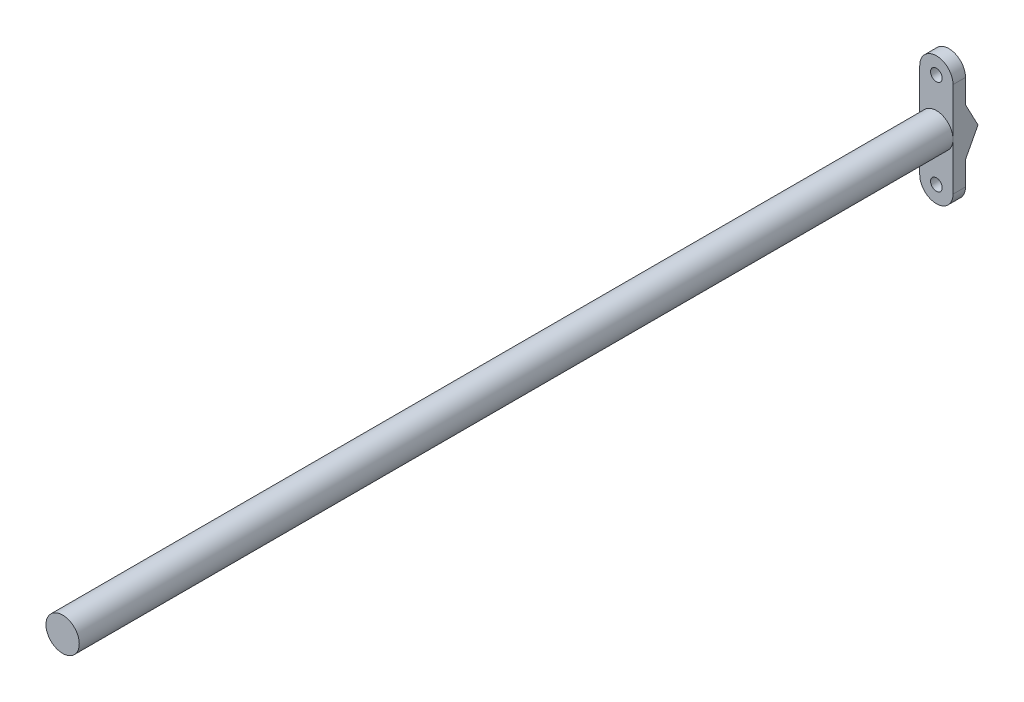
ISO-10303-21;
HEADER;
FILE_DESCRIPTION(('STEP AP214'),'2;1');
FILE_NAME('part.step','',(''),(''),'','','');
FILE_SCHEMA(('AUTOMOTIVE_DESIGN { 1 0 10303 214 1 1 1 1 }'));
ENDSEC;
DATA;
#1=APPLICATION_CONTEXT('core data for automotive mechanical design processes');
#2=APPLICATION_PROTOCOL_DEFINITION('international standard','automotive_design',2000,#1);
#3=PRODUCT_CONTEXT('',#1,'mechanical');
#4=PRODUCT('Part','Part','',(#3));
#5=PRODUCT_RELATED_PRODUCT_CATEGORY('part','',(#4));
#6=PRODUCT_DEFINITION_FORMATION('','',#4);
#7=PRODUCT_DEFINITION_CONTEXT('part definition',#1,'design');
#8=PRODUCT_DEFINITION('design','',#6,#7);
#9=PRODUCT_DEFINITION_SHAPE('','',#8);
#10=(LENGTH_UNIT() NAMED_UNIT(*) SI_UNIT(.MILLI.,.METRE.));
#11=(NAMED_UNIT(*) PLANE_ANGLE_UNIT() SI_UNIT($,.RADIAN.));
#12=(NAMED_UNIT(*) SI_UNIT($,.STERADIAN.) SOLID_ANGLE_UNIT());
#13=UNCERTAINTY_MEASURE_WITH_UNIT(LENGTH_MEASURE(1.E-05),#10,'distance_accuracy_value','');
#14=(GEOMETRIC_REPRESENTATION_CONTEXT(3) GLOBAL_UNCERTAINTY_ASSIGNED_CONTEXT((#13)) GLOBAL_UNIT_ASSIGNED_CONTEXT((#10,
#11,#12)) REPRESENTATION_CONTEXT('',''));
#15=CARTESIAN_POINT('',(0.,0.,0.));
#16=DIRECTION('',(0.,0.,1.));
#17=DIRECTION('',(1.,0.,0.));
#18=AXIS2_PLACEMENT_3D('',#15,#16,#17);
#19=CARTESIAN_POINT('',(4.,-11.4,3.));
#20=DIRECTION('',(-1.,0.,0.));
#21=DIRECTION('',(0.,0.,1.));
#22=AXIS2_PLACEMENT_3D('',#19,#20,#21);
#23=PLANE('',#22);
#24=DIRECTION('',(0.,1.,0.));
#25=VECTOR('',#24,1.);
#26=CARTESIAN_POINT('',(4.,-11.4,0.));
#27=LINE('',#26,#25);
#28=CARTESIAN_POINT('',(4.,-11.4,0.));
#29=VERTEX_POINT('',#28);
#30=CARTESIAN_POINT('',(4.,-5.7,0.));
#31=VERTEX_POINT('',#30);
#32=EDGE_CURVE('E154',#29,#31,#27,.T.);
#33=ORIENTED_EDGE('',*,*,#32,.T.);
#34=DIRECTION('',(0.,-0.884918222381982,0.465746432832622));
#35=VECTOR('',#34,1.);
#36=CARTESIAN_POINT('',(4.,-1.23644251626898,-2.34924078091106));
#37=LINE('',#36,#35);
#38=CARTESIAN_POINT('',(4.,0.,-3.));
#39=VERTEX_POINT('',#38);
#40=EDGE_CURVE('E135',#39,#31,#37,.T.);
#41=ORIENTED_EDGE('',*,*,#40,.F.);
#42=DIRECTION('',(0.,0.884918222381982,0.465746432832622));
#43=VECTOR('',#42,1.);
#44=CARTESIAN_POINT('',(4.,1.23644251626898,-2.34924078091106));
#45=LINE('',#44,#43);
#46=CARTESIAN_POINT('',(4.,5.7,0.));
#47=VERTEX_POINT('',#46);
#48=EDGE_CURVE('E144',#39,#47,#45,.T.);
#49=ORIENTED_EDGE('',*,*,#48,.T.);
#50=CARTESIAN_POINT('',(4.,11.4,0.));
#51=VERTEX_POINT('',#50);
#52=EDGE_CURVE('E172',#47,#51,#27,.T.);
#53=ORIENTED_EDGE('',*,*,#52,.T.);
#54=DIRECTION('',(0.,0.,-1.));
#55=VECTOR('',#54,1.);
#56=CARTESIAN_POINT('',(4.,11.4,3.));
#57=LINE('',#56,#55);
#58=CARTESIAN_POINT('',(4.,11.4,3.));
#59=VERTEX_POINT('',#58);
#60=EDGE_CURVE('E163',#59,#51,#57,.T.);
#61=ORIENTED_EDGE('',*,*,#60,.F.);
#62=DIRECTION('',(0.,1.,0.));
#63=VECTOR('',#62,1.);
#64=CARTESIAN_POINT('',(4.,-11.4,3.));
#65=LINE('',#64,#63);
#66=CARTESIAN_POINT('',(4.,0.,3.));
#67=VERTEX_POINT('',#66);
#68=EDGE_CURVE('E184',#67,#59,#65,.T.);
#69=ORIENTED_EDGE('',*,*,#68,.F.);
#70=CARTESIAN_POINT('',(4.,-11.4,3.));
#71=VERTEX_POINT('',#70);
#72=EDGE_CURVE('E107',#71,#67,#65,.T.);
#73=ORIENTED_EDGE('',*,*,#72,.F.);
#74=DIRECTION('',(0.,0.,-1.));
#75=VECTOR('',#74,1.);
#76=CARTESIAN_POINT('',(4.,-11.4,3.));
#77=LINE('',#76,#75);
#78=EDGE_CURVE('E62',#71,#29,#77,.T.);
#79=ORIENTED_EDGE('',*,*,#78,.T.);
#80=EDGE_LOOP('',(#33,#41,#49,#53,#61,#69,#73,#79));
#81=FACE_BOUND('',#80,.T.);
#82=ADVANCED_FACE('F58',(#81),#23,.F.);
#83=CARTESIAN_POINT('',(-4.,-11.4,3.));
#84=DIRECTION('',(1.,0.,0.));
#85=DIRECTION('',(0.,0.,-1.));
#86=AXIS2_PLACEMENT_3D('',#83,#84,#85);
#87=PLANE('',#86);
#88=DIRECTION('',(0.,0.884918222381982,0.465746432832622));
#89=VECTOR('',#88,1.);
#90=CARTESIAN_POINT('',(-4.,1.23644251626898,-2.34924078091106));
#91=LINE('',#90,#89);
#92=CARTESIAN_POINT('',(-4.,0.,-3.));
#93=VERTEX_POINT('',#92);
#94=CARTESIAN_POINT('',(-4.,5.7,0.));
#95=VERTEX_POINT('',#94);
#96=EDGE_CURVE('E143',#93,#95,#91,.T.);
#97=ORIENTED_EDGE('',*,*,#96,.F.);
#98=DIRECTION('',(0.,-0.884918222381982,0.465746432832622));
#99=VECTOR('',#98,1.);
#100=CARTESIAN_POINT('',(-4.,-1.23644251626898,-2.34924078091106));
#101=LINE('',#100,#99);
#102=CARTESIAN_POINT('',(-4.,-5.7,0.));
#103=VERTEX_POINT('',#102);
#104=EDGE_CURVE('E132',#93,#103,#101,.T.);
#105=ORIENTED_EDGE('',*,*,#104,.T.);
#106=DIRECTION('',(0.,-1.,0.));
#107=VECTOR('',#106,1.);
#108=CARTESIAN_POINT('',(-4.,-11.4,0.));
#109=LINE('',#108,#107);
#110=CARTESIAN_POINT('',(-4.,-11.4,0.));
#111=VERTEX_POINT('',#110);
#112=EDGE_CURVE('E100',#103,#111,#109,.T.);
#113=ORIENTED_EDGE('',*,*,#112,.T.);
#114=DIRECTION('',(0.,0.,-1.));
#115=VECTOR('',#114,1.);
#116=CARTESIAN_POINT('',(-4.,-11.4,3.));
#117=LINE('',#116,#115);
#118=CARTESIAN_POINT('',(-4.,-11.4,3.));
#119=VERTEX_POINT('',#118);
#120=EDGE_CURVE('E158',#119,#111,#117,.T.);
#121=ORIENTED_EDGE('',*,*,#120,.F.);
#122=DIRECTION('',(0.,-1.,0.));
#123=VECTOR('',#122,1.);
#124=CARTESIAN_POINT('',(-4.,-11.4,3.));
#125=LINE('',#124,#123);
#126=CARTESIAN_POINT('',(-4.,0.,3.));
#127=VERTEX_POINT('',#126);
#128=EDGE_CURVE('E78',#127,#119,#125,.T.);
#129=ORIENTED_EDGE('',*,*,#128,.F.);
#130=CARTESIAN_POINT('',(-4.,11.4,3.));
#131=VERTEX_POINT('',#130);
#132=EDGE_CURVE('E161',#131,#127,#125,.T.);
#133=ORIENTED_EDGE('',*,*,#132,.F.);
#134=DIRECTION('',(0.,0.,-1.));
#135=VECTOR('',#134,1.);
#136=CARTESIAN_POINT('',(-4.,11.4,3.));
#137=LINE('',#136,#135);
#138=CARTESIAN_POINT('',(-4.,11.4,0.));
#139=VERTEX_POINT('',#138);
#140=EDGE_CURVE('E160',#131,#139,#137,.T.);
#141=ORIENTED_EDGE('',*,*,#140,.T.);
#142=EDGE_CURVE('E150',#139,#95,#109,.T.);
#143=ORIENTED_EDGE('',*,*,#142,.T.);
#144=EDGE_LOOP('',(#97,#105,#113,#121,#129,#133,#141,#143));
#145=FACE_BOUND('',#144,.T.);
#146=ADVANCED_FACE('F141',(#145),#87,.F.);
#147=CARTESIAN_POINT('',(0.,-11.4,0.));
#148=DIRECTION('',(0.,0.,1.));
#149=DIRECTION('',(1.,0.,0.));
#150=AXIS2_PLACEMENT_3D('',#147,#148,#149);
#151=PLANE('',#150);
#152=CARTESIAN_POINT('',(0.,-11.4,0.));
#153=DIRECTION('',(0.,0.,1.));
#154=DIRECTION('',(-1.,0.,0.));
#155=AXIS2_PLACEMENT_3D('',#152,#153,#154);
#156=CIRCLE('',#155,1.4);
#157=CARTESIAN_POINT('',(-1.4,-11.4,0.));
#158=VERTEX_POINT('',#157);
#159=EDGE_CURVE('E189',#158,#158,#156,.T.);
#160=ORIENTED_EDGE('',*,*,#159,.T.);
#161=EDGE_LOOP('',(#160));
#162=FACE_BOUND('',#161,.T.);
#163=DIRECTION('',(-1.,0.,0.));
#164=VECTOR('',#163,1.);
#165=CARTESIAN_POINT('',(0.,-5.7,0.));
#166=LINE('',#165,#164);
#167=EDGE_CURVE('E130',#31,#103,#166,.T.);
#168=ORIENTED_EDGE('',*,*,#167,.F.);
#169=ORIENTED_EDGE('',*,*,#32,.F.);
#170=CARTESIAN_POINT('',(0.,-11.4,0.));
#171=DIRECTION('',(0.,0.,1.));
#172=DIRECTION('',(1.,0.,0.));
#173=AXIS2_PLACEMENT_3D('',#170,#171,#172);
#174=CIRCLE('',#173,4.);
#175=EDGE_CURVE('E149',#111,#29,#174,.T.);
#176=ORIENTED_EDGE('',*,*,#175,.F.);
#177=ORIENTED_EDGE('',*,*,#112,.F.);
#178=EDGE_LOOP('',(#168,#169,#176,#177));
#179=FACE_BOUND('',#178,.T.);
#180=ADVANCED_FACE('F147',(#162,#179),#151,.F.);
#181=CARTESIAN_POINT('',(0.,-11.4,3.));
#182=DIRECTION('',(0.,0.,1.));
#183=DIRECTION('',(1.,0.,0.));
#184=AXIS2_PLACEMENT_3D('',#181,#182,#183);
#185=PLANE('',#184);
#186=CARTESIAN_POINT('',(0.,0.,3.));
#187=DIRECTION('',(0.,0.,1.));
#188=DIRECTION('',(1.,0.,0.));
#189=AXIS2_PLACEMENT_3D('',#186,#187,#188);
#190=CIRCLE('',#189,4.);
#191=EDGE_CURVE('E68',#67,#127,#190,.T.);
#192=ORIENTED_EDGE('',*,*,#191,.F.);
#193=ORIENTED_EDGE('',*,*,#68,.T.);
#194=CARTESIAN_POINT('',(0.,11.4,3.));
#195=DIRECTION('',(0.,0.,1.));
#196=DIRECTION('',(1.,0.,0.));
#197=AXIS2_PLACEMENT_3D('',#194,#195,#196);
#198=CIRCLE('',#197,4.);
#199=EDGE_CURVE('E181',#59,#131,#198,.T.);
#200=ORIENTED_EDGE('',*,*,#199,.T.);
#201=ORIENTED_EDGE('',*,*,#132,.T.);
#202=EDGE_LOOP('',(#192,#193,#200,#201));
#203=FACE_BOUND('',#202,.T.);
#204=CARTESIAN_POINT('',(0.,11.4,3.));
#205=DIRECTION('',(0.,0.,1.));
#206=DIRECTION('',(1.,0.,0.));
#207=AXIS2_PLACEMENT_3D('',#204,#205,#206);
#208=CIRCLE('',#207,1.4);
#209=CARTESIAN_POINT('',(1.4,11.4,3.));
#210=VERTEX_POINT('',#209);
#211=EDGE_CURVE('E173',#210,#210,#208,.T.);
#212=ORIENTED_EDGE('',*,*,#211,.F.);
#213=EDGE_LOOP('',(#212));
#214=FACE_BOUND('',#213,.T.);
#215=ADVANCED_FACE('F218',(#203,#214),#185,.T.);
#216=EDGE_CURVE('E12',#127,#67,#190,.T.);
#217=ORIENTED_EDGE('',*,*,#216,.F.);
#218=ORIENTED_EDGE('',*,*,#128,.T.);
#219=CARTESIAN_POINT('',(0.,-11.4,3.));
#220=DIRECTION('',(0.,0.,1.));
#221=DIRECTION('',(1.,0.,0.));
#222=AXIS2_PLACEMENT_3D('',#219,#220,#221);
#223=CIRCLE('',#222,4.);
#224=EDGE_CURVE('E153',#119,#71,#223,.T.);
#225=ORIENTED_EDGE('',*,*,#224,.T.);
#226=ORIENTED_EDGE('',*,*,#72,.T.);
#227=EDGE_LOOP('',(#217,#218,#225,#226));
#228=FACE_BOUND('',#227,.T.);
#229=CARTESIAN_POINT('',(0.,-11.4,3.));
#230=DIRECTION('',(0.,0.,1.));
#231=DIRECTION('',(-1.,0.,0.));
#232=AXIS2_PLACEMENT_3D('',#229,#230,#231);
#233=CIRCLE('',#232,1.4);
#234=CARTESIAN_POINT('',(-1.4,-11.4,3.));
#235=VERTEX_POINT('',#234);
#236=EDGE_CURVE('E187',#235,#235,#233,.T.);
#237=ORIENTED_EDGE('',*,*,#236,.F.);
#238=EDGE_LOOP('',(#237));
#239=FACE_BOUND('',#238,.T.);
#240=ADVANCED_FACE('F247',(#228,#239),#185,.T.);
#241=ORIENTED_EDGE('',*,*,#52,.F.);
#242=DIRECTION('',(-1.,0.,0.));
#243=VECTOR('',#242,1.);
#244=CARTESIAN_POINT('',(0.,5.7,0.));
#245=LINE('',#244,#243);
#246=EDGE_CURVE('E138',#47,#95,#245,.T.);
#247=ORIENTED_EDGE('',*,*,#246,.T.);
#248=ORIENTED_EDGE('',*,*,#142,.F.);
#249=CARTESIAN_POINT('',(0.,11.4,0.));
#250=DIRECTION('',(0.,0.,1.));
#251=DIRECTION('',(1.,0.,0.));
#252=AXIS2_PLACEMENT_3D('',#249,#250,#251);
#253=CIRCLE('',#252,4.);
#254=EDGE_CURVE('E151',#51,#139,#253,.T.);
#255=ORIENTED_EDGE('',*,*,#254,.F.);
#256=EDGE_LOOP('',(#241,#247,#248,#255));
#257=FACE_BOUND('',#256,.T.);
#258=CARTESIAN_POINT('',(0.,11.4,0.));
#259=DIRECTION('',(0.,0.,1.));
#260=DIRECTION('',(1.,0.,0.));
#261=AXIS2_PLACEMENT_3D('',#258,#259,#260);
#262=CIRCLE('',#261,1.4);
#263=CARTESIAN_POINT('',(1.4,11.4,0.));
#264=VERTEX_POINT('',#263);
#265=EDGE_CURVE('E176',#264,#264,#262,.T.);
#266=ORIENTED_EDGE('',*,*,#265,.T.);
#267=EDGE_LOOP('',(#266));
#268=FACE_BOUND('',#267,.T.);
#269=ADVANCED_FACE('F211',(#257,#268),#151,.F.);
#270=CARTESIAN_POINT('',(0.,-11.4,3.));
#271=DIRECTION('',(0.,0.,-1.));
#272=DIRECTION('',(-1.,0.,0.));
#273=AXIS2_PLACEMENT_3D('',#270,#271,#272);
#274=CYLINDRICAL_SURFACE('',#273,4.);
#275=ORIENTED_EDGE('',*,*,#175,.T.);
#276=ORIENTED_EDGE('',*,*,#78,.F.);
#277=ORIENTED_EDGE('',*,*,#224,.F.);
#278=ORIENTED_EDGE('',*,*,#120,.T.);
#279=EDGE_LOOP('',(#275,#276,#277,#278));
#280=FACE_BOUND('',#279,.T.);
#281=ADVANCED_FACE('F60',(#280),#274,.T.);
#282=CARTESIAN_POINT('',(0.,11.4,3.));
#283=DIRECTION('',(0.,0.,-1.));
#284=DIRECTION('',(-1.,0.,0.));
#285=AXIS2_PLACEMENT_3D('',#282,#283,#284);
#286=CYLINDRICAL_SURFACE('',#285,4.);
#287=ORIENTED_EDGE('',*,*,#254,.T.);
#288=ORIENTED_EDGE('',*,*,#140,.F.);
#289=ORIENTED_EDGE('',*,*,#199,.F.);
#290=ORIENTED_EDGE('',*,*,#60,.T.);
#291=EDGE_LOOP('',(#287,#288,#289,#290));
#292=FACE_BOUND('',#291,.T.);
#293=ADVANCED_FACE('F215',(#292),#286,.T.);
#294=CARTESIAN_POINT('',(0.,11.4,3.));
#295=DIRECTION('',(0.,0.,-1.));
#296=DIRECTION('',(-1.,0.,0.));
#297=AXIS2_PLACEMENT_3D('',#294,#295,#296);
#298=CYLINDRICAL_SURFACE('',#297,1.4);
#299=ORIENTED_EDGE('',*,*,#211,.T.);
#300=EDGE_LOOP('',(#299));
#301=FACE_BOUND('',#300,.T.);
#302=ORIENTED_EDGE('',*,*,#265,.F.);
#303=EDGE_LOOP('',(#302));
#304=FACE_BOUND('',#303,.T.);
#305=ADVANCED_FACE('F233',(#301,#304),#298,.F.);
#306=CARTESIAN_POINT('',(0.,-11.4,3.));
#307=DIRECTION('',(0.,0.,-1.));
#308=DIRECTION('',(-1.,0.,0.));
#309=AXIS2_PLACEMENT_3D('',#306,#307,#308);
#310=CYLINDRICAL_SURFACE('',#309,1.4);
#311=ORIENTED_EDGE('',*,*,#236,.T.);
#312=EDGE_LOOP('',(#311));
#313=FACE_BOUND('',#312,.T.);
#314=ORIENTED_EDGE('',*,*,#159,.F.);
#315=EDGE_LOOP('',(#314));
#316=FACE_BOUND('',#315,.T.);
#317=ADVANCED_FACE('F224',(#313,#316),#310,.F.);
#318=CARTESIAN_POINT('',(0.,0.,213.));
#319=DIRECTION('',(0.,0.,-1.));
#320=DIRECTION('',(-1.,0.,0.));
#321=AXIS2_PLACEMENT_3D('',#318,#319,#320);
#322=CYLINDRICAL_SURFACE('',#321,4.);
#323=CARTESIAN_POINT('',(0.,0.,213.));
#324=DIRECTION('',(0.,0.,1.));
#325=DIRECTION('',(1.,0.,0.));
#326=AXIS2_PLACEMENT_3D('',#323,#324,#325);
#327=CIRCLE('',#326,4.);
#328=CARTESIAN_POINT('',(4.,0.,213.));
#329=VERTEX_POINT('',#328);
#330=EDGE_CURVE('E192',#329,#329,#327,.T.);
#331=ORIENTED_EDGE('',*,*,#330,.F.);
#332=EDGE_LOOP('',(#331));
#333=FACE_BOUND('',#332,.T.);
#334=ORIENTED_EDGE('',*,*,#191,.T.);
#335=ORIENTED_EDGE('',*,*,#216,.T.);
#336=EDGE_LOOP('',(#334,#335));
#337=FACE_BOUND('',#336,.T.);
#338=ADVANCED_FACE('F221',(#333,#337),#322,.T.);
#339=CARTESIAN_POINT('',(0.,0.,213.));
#340=DIRECTION('',(0.,0.,1.));
#341=DIRECTION('',(1.,0.,0.));
#342=AXIS2_PLACEMENT_3D('',#339,#340,#341);
#343=PLANE('',#342);
#344=ORIENTED_EDGE('',*,*,#330,.T.);
#345=EDGE_LOOP('',(#344));
#346=FACE_BOUND('',#345,.T.);
#347=ADVANCED_FACE('F223',(#346),#343,.T.);
#348=CARTESIAN_POINT('',(-4.,1.23644251626898,-2.34924078091106));
#349=DIRECTION('',(0.,0.465746432832622,-0.884918222381982));
#350=DIRECTION('',(0.,0.884918222381982,0.465746432832622));
#351=AXIS2_PLACEMENT_3D('',#348,#349,#350);
#352=PLANE('',#351);
#353=ORIENTED_EDGE('',*,*,#48,.F.);
#354=DIRECTION('',(1.,0.,0.));
#355=VECTOR('',#354,1.);
#356=CARTESIAN_POINT('',(-4.,0.,-3.));
#357=LINE('',#356,#355);
#358=EDGE_CURVE('E200',#93,#39,#357,.T.);
#359=ORIENTED_EDGE('',*,*,#358,.F.);
#360=ORIENTED_EDGE('',*,*,#96,.T.);
#361=ORIENTED_EDGE('',*,*,#246,.F.);
#362=EDGE_LOOP('',(#353,#359,#360,#361));
#363=FACE_BOUND('',#362,.T.);
#364=ADVANCED_FACE('F207',(#363),#352,.T.);
#365=CARTESIAN_POINT('',(-4.,-1.23644251626898,-2.34924078091106));
#366=DIRECTION('',(0.,0.465746432832622,0.884918222381982));
#367=DIRECTION('',(0.,-0.884918222381982,0.465746432832622));
#368=AXIS2_PLACEMENT_3D('',#365,#366,#367);
#369=PLANE('',#368);
#370=ORIENTED_EDGE('',*,*,#40,.T.);
#371=ORIENTED_EDGE('',*,*,#167,.T.);
#372=ORIENTED_EDGE('',*,*,#104,.F.);
#373=ORIENTED_EDGE('',*,*,#358,.T.);
#374=EDGE_LOOP('',(#370,#371,#372,#373));
#375=FACE_BOUND('',#374,.T.);
#376=ADVANCED_FACE('F131',(#375),#369,.F.);
#377=CLOSED_SHELL('',(#82,#146,#180,#215,#240,#269,#281,#293,#305,#317,#338,#347,#364,#376));
#378=MANIFOLD_SOLID_BREP('B2',#377);
#379=ADVANCED_BREP_SHAPE_REPRESENTATION('',(#18,#378),#14);
#380=SHAPE_DEFINITION_REPRESENTATION(#9,#379);
ENDSEC;
END-ISO-10303-21;
